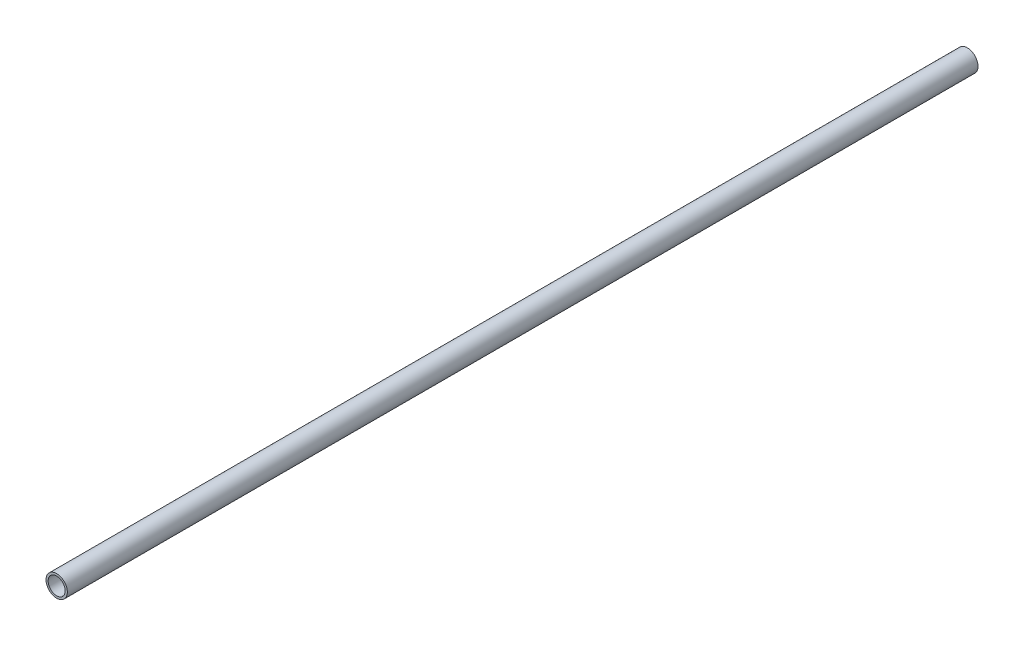
ISO-10303-21;
HEADER;
FILE_DESCRIPTION(('STEP AP214'),'2;1');
FILE_NAME('part.step','',(''),(''),'','','');
FILE_SCHEMA(('AUTOMOTIVE_DESIGN { 1 0 10303 214 1 1 1 1 }'));
ENDSEC;
DATA;
#1=APPLICATION_CONTEXT('core data for automotive mechanical design processes');
#2=APPLICATION_PROTOCOL_DEFINITION('international standard','automotive_design',2000,#1);
#3=PRODUCT_CONTEXT('',#1,'mechanical');
#4=PRODUCT('Part','Part','',(#3));
#5=PRODUCT_RELATED_PRODUCT_CATEGORY('part','',(#4));
#6=PRODUCT_DEFINITION_FORMATION('','',#4);
#7=PRODUCT_DEFINITION_CONTEXT('part definition',#1,'design');
#8=PRODUCT_DEFINITION('design','',#6,#7);
#9=PRODUCT_DEFINITION_SHAPE('','',#8);
#10=(LENGTH_UNIT() NAMED_UNIT(*) SI_UNIT(.MILLI.,.METRE.));
#11=(NAMED_UNIT(*) PLANE_ANGLE_UNIT() SI_UNIT($,.RADIAN.));
#12=(NAMED_UNIT(*) SI_UNIT($,.STERADIAN.) SOLID_ANGLE_UNIT());
#13=UNCERTAINTY_MEASURE_WITH_UNIT(LENGTH_MEASURE(1.E-05),#10,'distance_accuracy_value','');
#14=(GEOMETRIC_REPRESENTATION_CONTEXT(3) GLOBAL_UNCERTAINTY_ASSIGNED_CONTEXT((#13)) GLOBAL_UNIT_ASSIGNED_CONTEXT((#10,
#11,#12)) REPRESENTATION_CONTEXT('',''));
#15=CARTESIAN_POINT('',(0.,0.,0.));
#16=DIRECTION('',(0.,0.,1.));
#17=DIRECTION('',(1.,0.,0.));
#18=AXIS2_PLACEMENT_3D('',#15,#16,#17);
#19=CARTESIAN_POINT('',(200.132445986145,0.,213.378969569803));
#20=DIRECTION('',(0.,0.,-1.));
#21=DIRECTION('',(-1.,0.,0.));
#22=AXIS2_PLACEMENT_3D('',#19,#20,#21);
#23=PLANE('',#22);
#24=CARTESIAN_POINT('',(200.132445986145,0.,213.378969569803));
#25=DIRECTION('',(0.,0.,-1.));
#26=DIRECTION('',(-1.,0.,0.));
#27=AXIS2_PLACEMENT_3D('',#24,#25,#26);
#28=CIRCLE('',#27,4.);
#29=CARTESIAN_POINT('',(196.132445986145,0.,213.378969569803));
#30=VERTEX_POINT('',#29);
#31=EDGE_CURVE('E70',#30,#30,#28,.F.);
#32=ORIENTED_EDGE('',*,*,#31,.F.);
#33=EDGE_LOOP('',(#32));
#34=FACE_BOUND('',#33,.T.);
#35=CARTESIAN_POINT('',(200.132445986145,0.,213.378969569803));
#36=DIRECTION('',(0.,0.,-1.));
#37=DIRECTION('',(-1.,0.,0.));
#38=AXIS2_PLACEMENT_3D('',#35,#36,#37);
#39=CIRCLE('',#38,5.);
#40=CARTESIAN_POINT('',(195.132445986145,0.,213.378969569803));
#41=VERTEX_POINT('',#40);
#42=EDGE_CURVE('E60',#41,#41,#39,.T.);
#43=ORIENTED_EDGE('',*,*,#42,.F.);
#44=EDGE_LOOP('',(#43));
#45=FACE_BOUND('',#44,.T.);
#46=ADVANCED_FACE('F53',(#34,#45),#23,.F.);
#47=CARTESIAN_POINT('',(200.132445986145,0.,-213.378969569803));
#48=DIRECTION('',(0.,0.,-1.));
#49=DIRECTION('',(-1.,0.,0.));
#50=AXIS2_PLACEMENT_3D('',#47,#48,#49);
#51=PLANE('',#50);
#52=CARTESIAN_POINT('',(200.132445986145,0.,-213.378969569803));
#53=DIRECTION('',(0.,0.,-1.));
#54=DIRECTION('',(-1.,0.,0.));
#55=AXIS2_PLACEMENT_3D('',#52,#53,#54);
#56=CIRCLE('',#55,4.);
#57=CARTESIAN_POINT('',(196.132445986145,0.,-213.378969569803));
#58=VERTEX_POINT('',#57);
#59=EDGE_CURVE('E65',#58,#58,#56,.F.);
#60=ORIENTED_EDGE('',*,*,#59,.T.);
#61=EDGE_LOOP('',(#60));
#62=FACE_BOUND('',#61,.T.);
#63=CARTESIAN_POINT('',(200.132445986145,0.,-213.378969569803));
#64=DIRECTION('',(0.,0.,-1.));
#65=DIRECTION('',(-1.,0.,0.));
#66=AXIS2_PLACEMENT_3D('',#63,#64,#65);
#67=CIRCLE('',#66,5.);
#68=CARTESIAN_POINT('',(195.132445986145,0.,-213.378969569803));
#69=VERTEX_POINT('',#68);
#70=EDGE_CURVE('E11',#69,#69,#67,.T.);
#71=ORIENTED_EDGE('',*,*,#70,.T.);
#72=EDGE_LOOP('',(#71));
#73=FACE_BOUND('',#72,.T.);
#74=ADVANCED_FACE('F82',(#62,#73),#51,.T.);
#75=CARTESIAN_POINT('',(200.132445986145,0.,213.378969569803));
#76=DIRECTION('',(0.,0.,-1.));
#77=DIRECTION('',(-1.,0.,0.));
#78=AXIS2_PLACEMENT_3D('',#75,#76,#77);
#79=CYLINDRICAL_SURFACE('',#78,5.);
#80=ORIENTED_EDGE('',*,*,#70,.F.);
#81=EDGE_LOOP('',(#80));
#82=FACE_BOUND('',#81,.T.);
#83=ORIENTED_EDGE('',*,*,#42,.T.);
#84=EDGE_LOOP('',(#83));
#85=FACE_BOUND('',#84,.T.);
#86=ADVANCED_FACE('F86',(#82,#85),#79,.T.);
#87=CARTESIAN_POINT('',(200.132445986145,0.,214.378969569803));
#88=DIRECTION('',(0.,0.,-1.));
#89=DIRECTION('',(-1.,0.,0.));
#90=AXIS2_PLACEMENT_3D('',#87,#88,#89);
#91=CYLINDRICAL_SURFACE('',#90,4.);
#92=ORIENTED_EDGE('',*,*,#31,.T.);
#93=EDGE_LOOP('',(#92));
#94=FACE_BOUND('',#93,.T.);
#95=ORIENTED_EDGE('',*,*,#59,.F.);
#96=EDGE_LOOP('',(#95));
#97=FACE_BOUND('',#96,.T.);
#98=ADVANCED_FACE('F77',(#94,#97),#91,.F.);
#99=CLOSED_SHELL('',(#46,#74,#86,#98));
#100=MANIFOLD_SOLID_BREP('B2',#99);
#101=ADVANCED_BREP_SHAPE_REPRESENTATION('',(#18,#100),#14);
#102=SHAPE_DEFINITION_REPRESENTATION(#9,#101);
ENDSEC;
END-ISO-10303-21;
